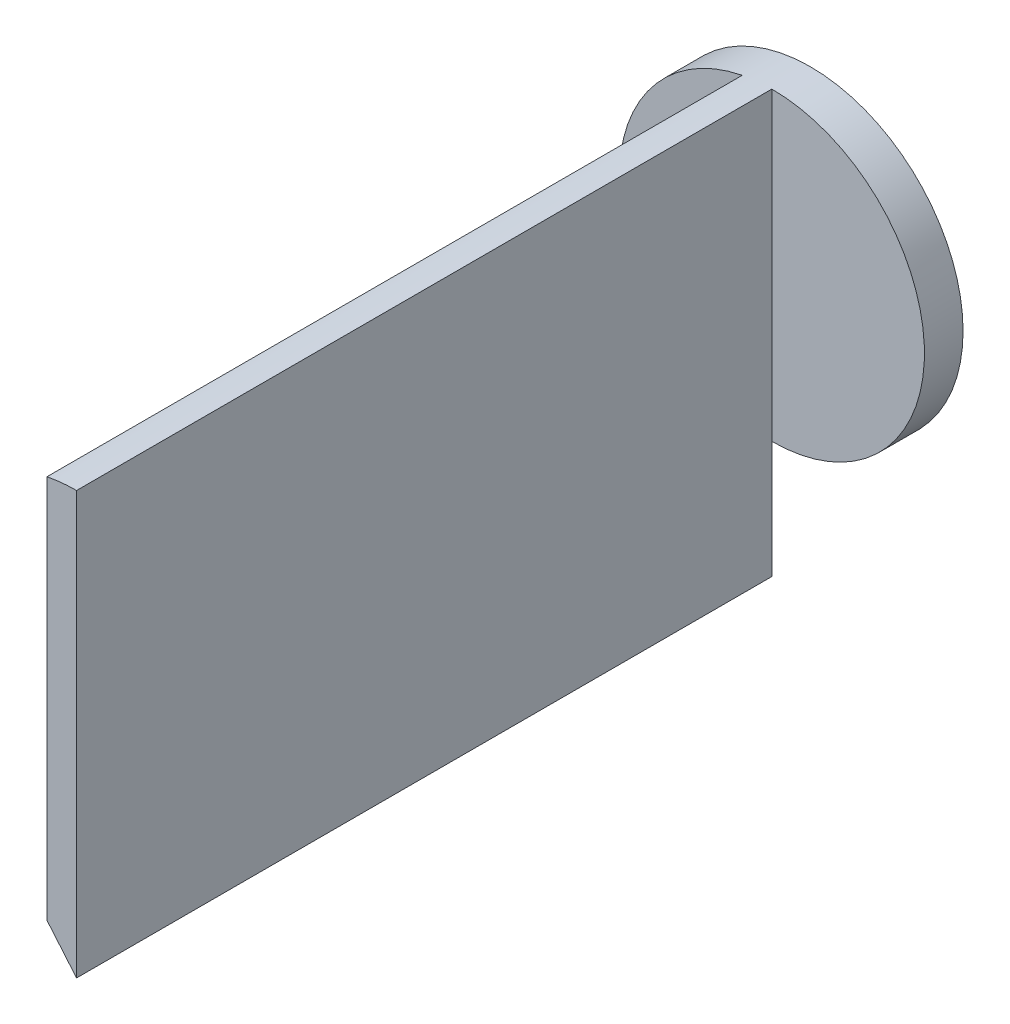
ISO-10303-21;
HEADER;
FILE_DESCRIPTION(('STEP AP214'),'2;1');
FILE_NAME('part.step','',(''),(''),'','','');
FILE_SCHEMA(('AUTOMOTIVE_DESIGN { 1 0 10303 214 1 1 1 1 }'));
ENDSEC;
DATA;
#1=APPLICATION_CONTEXT('core data for automotive mechanical design processes');
#2=APPLICATION_PROTOCOL_DEFINITION('international standard','automotive_design',2000,#1);
#3=PRODUCT_CONTEXT('',#1,'mechanical');
#4=PRODUCT('Part','Part','',(#3));
#5=PRODUCT_RELATED_PRODUCT_CATEGORY('part','',(#4));
#6=PRODUCT_DEFINITION_FORMATION('','',#4);
#7=PRODUCT_DEFINITION_CONTEXT('part definition',#1,'design');
#8=PRODUCT_DEFINITION('design','',#6,#7);
#9=PRODUCT_DEFINITION_SHAPE('','',#8);
#10=(LENGTH_UNIT() NAMED_UNIT(*) SI_UNIT(.MILLI.,.METRE.));
#11=(NAMED_UNIT(*) PLANE_ANGLE_UNIT() SI_UNIT($,.RADIAN.));
#12=(NAMED_UNIT(*) SI_UNIT($,.STERADIAN.) SOLID_ANGLE_UNIT());
#13=UNCERTAINTY_MEASURE_WITH_UNIT(LENGTH_MEASURE(1.E-05),#10,'distance_accuracy_value','');
#14=(GEOMETRIC_REPRESENTATION_CONTEXT(3) GLOBAL_UNCERTAINTY_ASSIGNED_CONTEXT((#13)) GLOBAL_UNIT_ASSIGNED_CONTEXT((#10,
#11,#12)) REPRESENTATION_CONTEXT('',''));
#15=CARTESIAN_POINT('',(0.,0.,0.));
#16=DIRECTION('',(0.,0.,1.));
#17=DIRECTION('',(1.,0.,0.));
#18=AXIS2_PLACEMENT_3D('',#15,#16,#17);
#19=CARTESIAN_POINT('',(0.,0.,10.));
#20=DIRECTION('',(0.,0.,1.));
#21=DIRECTION('',(1.,0.,0.));
#22=AXIS2_PLACEMENT_3D('',#19,#20,#21);
#23=PLANE('',#22);
#24=DIRECTION('',(0.,-1.,0.));
#25=VECTOR('',#24,1.);
#26=CARTESIAN_POINT('',(-7.66694459378493,38.7487758269841,10.));
#27=LINE('',#26,#25);
#28=CARTESIAN_POINT('',(-7.66694459378493,38.7487758269841,10.));
#29=VERTEX_POINT('',#28);
#30=CARTESIAN_POINT('',(-7.66694459378492,-38.7487758269841,10.));
#31=VERTEX_POINT('',#30);
#32=EDGE_CURVE('E111',#29,#31,#27,.T.);
#33=ORIENTED_EDGE('',*,*,#32,.F.);
#34=CARTESIAN_POINT('',(0.,0.,10.));
#35=DIRECTION('',(0.,0.,1.));
#36=DIRECTION('',(1.,0.,0.));
#37=AXIS2_PLACEMENT_3D('',#34,#35,#36);
#38=CIRCLE('',#37,39.4999957910635);
#39=EDGE_CURVE('E50',#29,#31,#38,.T.);
#40=ORIENTED_EDGE('',*,*,#39,.T.);
#41=EDGE_LOOP('',(#33,#40));
#42=FACE_BOUND('',#41,.T.);
#43=ADVANCED_FACE('F41',(#42),#23,.T.);
#44=CARTESIAN_POINT('',(0.,0.,10.));
#45=DIRECTION('',(0.,0.,-1.));
#46=DIRECTION('',(-1.,0.,0.));
#47=AXIS2_PLACEMENT_3D('',#44,#45,#46);
#48=CYLINDRICAL_SURFACE('',#47,39.4999957910635);
#49=ORIENTED_EDGE('',*,*,#39,.F.);
#50=DIRECTION('',(0.,0.,-1.));
#51=VECTOR('',#50,1.);
#52=CARTESIAN_POINT('',(-7.66694459378493,38.7487758269841,190.));
#53=LINE('',#52,#51);
#54=CARTESIAN_POINT('',(-7.66694459378493,38.7487758269841,190.));
#55=VERTEX_POINT('',#54);
#56=EDGE_CURVE('E119',#55,#29,#53,.T.);
#57=ORIENTED_EDGE('',*,*,#56,.F.);
#58=CARTESIAN_POINT('',(4.38885039422132E-13,-2.39391839684799E-12,190.));
#59=DIRECTION('',(0.,0.,1.));
#60=DIRECTION('',(-1.,0.,0.));
#61=AXIS2_PLACEMENT_3D('',#58,#59,#60);
#62=CIRCLE('',#61,39.4999957910659);
#63=CARTESIAN_POINT('',(0.,39.4999957910635,190.));
#64=VERTEX_POINT('',#63);
#65=EDGE_CURVE('E101',#64,#55,#62,.T.);
#66=ORIENTED_EDGE('',*,*,#65,.F.);
#67=DIRECTION('',(0.,0.,-1.));
#68=VECTOR('',#67,1.);
#69=CARTESIAN_POINT('',(0.,39.4999957910635,190.));
#70=LINE('',#69,#68);
#71=CARTESIAN_POINT('',(0.,39.4999957910635,10.));
#72=VERTEX_POINT('',#71);
#73=EDGE_CURVE('E98',#64,#72,#70,.T.);
#74=ORIENTED_EDGE('',*,*,#73,.T.);
#75=CARTESIAN_POINT('',(0.,-39.4999957910635,10.));
#76=VERTEX_POINT('',#75);
#77=EDGE_CURVE('E118',#76,#72,#38,.T.);
#78=ORIENTED_EDGE('',*,*,#77,.F.);
#79=EDGE_CURVE('E63',#31,#76,#38,.T.);
#80=ORIENTED_EDGE('',*,*,#79,.F.);
#81=EDGE_LOOP('',(#49,#57,#66,#74,#78,#80));
#82=FACE_BOUND('',#81,.T.);
#83=CARTESIAN_POINT('',(0.,0.,0.));
#84=DIRECTION('',(0.,0.,1.));
#85=DIRECTION('',(1.,0.,0.));
#86=AXIS2_PLACEMENT_3D('',#83,#84,#85);
#87=CIRCLE('',#86,39.4999957910635);
#88=CARTESIAN_POINT('',(39.4999957910635,0.,0.));
#89=VERTEX_POINT('',#88);
#90=EDGE_CURVE('E45',#89,#89,#87,.T.);
#91=ORIENTED_EDGE('',*,*,#90,.T.);
#92=EDGE_LOOP('',(#91));
#93=FACE_BOUND('',#92,.T.);
#94=ADVANCED_FACE('F43',(#82,#93),#48,.T.);
#95=DIRECTION('',(0.,1.,0.));
#96=VECTOR('',#95,1.);
#97=CARTESIAN_POINT('',(0.,-69.8000503093222,10.));
#98=LINE('',#97,#96);
#99=EDGE_CURVE('E11',#76,#72,#98,.T.);
#100=ORIENTED_EDGE('',*,*,#99,.F.);
#101=ORIENTED_EDGE('',*,*,#77,.T.);
#102=EDGE_LOOP('',(#100,#101));
#103=FACE_BOUND('',#102,.T.);
#104=ADVANCED_FACE('F140',(#103),#23,.T.);
#105=CARTESIAN_POINT('',(0.,0.,0.));
#106=DIRECTION('',(0.,0.,1.));
#107=DIRECTION('',(1.,0.,0.));
#108=AXIS2_PLACEMENT_3D('',#105,#106,#107);
#109=PLANE('',#108);
#110=ORIENTED_EDGE('',*,*,#90,.F.);
#111=EDGE_LOOP('',(#110));
#112=FACE_BOUND('',#111,.T.);
#113=ADVANCED_FACE('F143',(#112),#109,.F.);
#114=CARTESIAN_POINT('',(-7.66694459378492,-60.6941223755975,190.));
#115=DIRECTION('',(0.764961081852759,0.644076504190812,0.));
#116=DIRECTION('',(-0.644076504190812,0.764961081852759,0.));
#117=AXIS2_PLACEMENT_3D('',#114,#115,#116);
#118=PLANE('',#117);
#119=DIRECTION('',(0.644076504190812,-0.764961081852759,0.));
#120=VECTOR('',#119,1.);
#121=CARTESIAN_POINT('',(-7.66694459378492,-60.6941223755975,10.));
#122=LINE('',#121,#120);
#123=CARTESIAN_POINT('',(-7.66694459378492,-60.6941223755975,10.));
#124=VERTEX_POINT('',#123);
#125=CARTESIAN_POINT('',(0.,-69.8000503093222,10.));
#126=VERTEX_POINT('',#125);
#127=EDGE_CURVE('E115',#124,#126,#122,.T.);
#128=ORIENTED_EDGE('',*,*,#127,.T.);
#129=DIRECTION('',(0.,0.,-1.));
#130=VECTOR('',#129,1.);
#131=CARTESIAN_POINT('',(0.,-69.8000503093222,190.));
#132=LINE('',#131,#130);
#133=CARTESIAN_POINT('',(0.,-69.8000503093222,190.));
#134=VERTEX_POINT('',#133);
#135=EDGE_CURVE('E95',#134,#126,#132,.T.);
#136=ORIENTED_EDGE('',*,*,#135,.F.);
#137=DIRECTION('',(0.644076504190812,-0.764961081852759,0.));
#138=VECTOR('',#137,1.);
#139=CARTESIAN_POINT('',(-7.66694459378492,-60.6941223755975,190.));
#140=LINE('',#139,#138);
#141=CARTESIAN_POINT('',(-7.66694459378492,-60.6941223755975,190.));
#142=VERTEX_POINT('',#141);
#143=EDGE_CURVE('E102',#142,#134,#140,.T.);
#144=ORIENTED_EDGE('',*,*,#143,.F.);
#145=DIRECTION('',(0.,0.,-1.));
#146=VECTOR('',#145,1.);
#147=CARTESIAN_POINT('',(-7.66694459378492,-60.6941223755975,190.));
#148=LINE('',#147,#146);
#149=EDGE_CURVE('E135',#142,#124,#148,.T.);
#150=ORIENTED_EDGE('',*,*,#149,.T.);
#151=EDGE_LOOP('',(#128,#136,#144,#150));
#152=FACE_BOUND('',#151,.T.);
#153=ADVANCED_FACE('F113',(#152),#118,.F.);
#154=CARTESIAN_POINT('',(0.,-69.8000503093222,190.));
#155=DIRECTION('',(-1.,0.,0.));
#156=DIRECTION('',(0.,0.,1.));
#157=AXIS2_PLACEMENT_3D('',#154,#155,#156);
#158=PLANE('',#157);
#159=EDGE_CURVE('E52',#126,#76,#98,.T.);
#160=ORIENTED_EDGE('',*,*,#159,.T.);
#161=ORIENTED_EDGE('',*,*,#99,.T.);
#162=ORIENTED_EDGE('',*,*,#73,.F.);
#163=DIRECTION('',(0.,1.,0.));
#164=VECTOR('',#163,1.);
#165=CARTESIAN_POINT('',(0.,-69.8000503093222,190.));
#166=LINE('',#165,#164);
#167=EDGE_CURVE('E90',#134,#64,#166,.T.);
#168=ORIENTED_EDGE('',*,*,#167,.F.);
#169=ORIENTED_EDGE('',*,*,#135,.T.);
#170=EDGE_LOOP('',(#160,#161,#162,#168,#169));
#171=FACE_BOUND('',#170,.T.);
#172=ADVANCED_FACE('F93',(#171),#158,.F.);
#173=CARTESIAN_POINT('',(-7.66694459378493,38.7487758269841,190.));
#174=DIRECTION('',(1.,0.,0.));
#175=DIRECTION('',(0.,1.,0.));
#176=AXIS2_PLACEMENT_3D('',#173,#174,#175);
#177=PLANE('',#176);
#178=ORIENTED_EDGE('',*,*,#32,.T.);
#179=EDGE_CURVE('E128',#31,#124,#27,.T.);
#180=ORIENTED_EDGE('',*,*,#179,.T.);
#181=ORIENTED_EDGE('',*,*,#149,.F.);
#182=DIRECTION('',(0.,-1.,0.));
#183=VECTOR('',#182,1.);
#184=CARTESIAN_POINT('',(-7.66694459378493,38.7487758269841,190.));
#185=LINE('',#184,#183);
#186=EDGE_CURVE('E107',#55,#142,#185,.T.);
#187=ORIENTED_EDGE('',*,*,#186,.F.);
#188=ORIENTED_EDGE('',*,*,#56,.T.);
#189=EDGE_LOOP('',(#178,#180,#181,#187,#188));
#190=FACE_BOUND('',#189,.T.);
#191=ADVANCED_FACE('F132',(#190),#177,.F.);
#192=CARTESIAN_POINT('',(4.38885039422132E-13,-2.39391839684799E-12,190.));
#193=DIRECTION('',(0.,0.,-1.));
#194=DIRECTION('',(-1.,0.,0.));
#195=AXIS2_PLACEMENT_3D('',#192,#193,#194);
#196=PLANE('',#195);
#197=ORIENTED_EDGE('',*,*,#143,.T.);
#198=ORIENTED_EDGE('',*,*,#167,.T.);
#199=ORIENTED_EDGE('',*,*,#65,.T.);
#200=ORIENTED_EDGE('',*,*,#186,.T.);
#201=EDGE_LOOP('',(#197,#198,#199,#200));
#202=FACE_BOUND('',#201,.T.);
#203=ADVANCED_FACE('F105',(#202),#196,.F.);
#204=CARTESIAN_POINT('',(4.38885039422132E-13,-2.39391839684799E-12,10.));
#205=DIRECTION('',(0.,0.,-1.));
#206=DIRECTION('',(-1.,0.,0.));
#207=AXIS2_PLACEMENT_3D('',#204,#205,#206);
#208=PLANE('',#207);
#209=ORIENTED_EDGE('',*,*,#179,.F.);
#210=ORIENTED_EDGE('',*,*,#79,.T.);
#211=ORIENTED_EDGE('',*,*,#159,.F.);
#212=ORIENTED_EDGE('',*,*,#127,.F.);
#213=EDGE_LOOP('',(#209,#210,#211,#212));
#214=FACE_BOUND('',#213,.T.);
#215=ADVANCED_FACE('F129',(#214),#208,.T.);
#216=CLOSED_SHELL('',(#43,#94,#104,#113,#153,#172,#191,#203,#215));
#217=MANIFOLD_SOLID_BREP('B2',#216);
#218=ADVANCED_BREP_SHAPE_REPRESENTATION('',(#18,#217),#14);
#219=SHAPE_DEFINITION_REPRESENTATION(#9,#218);
ENDSEC;
END-ISO-10303-21;
